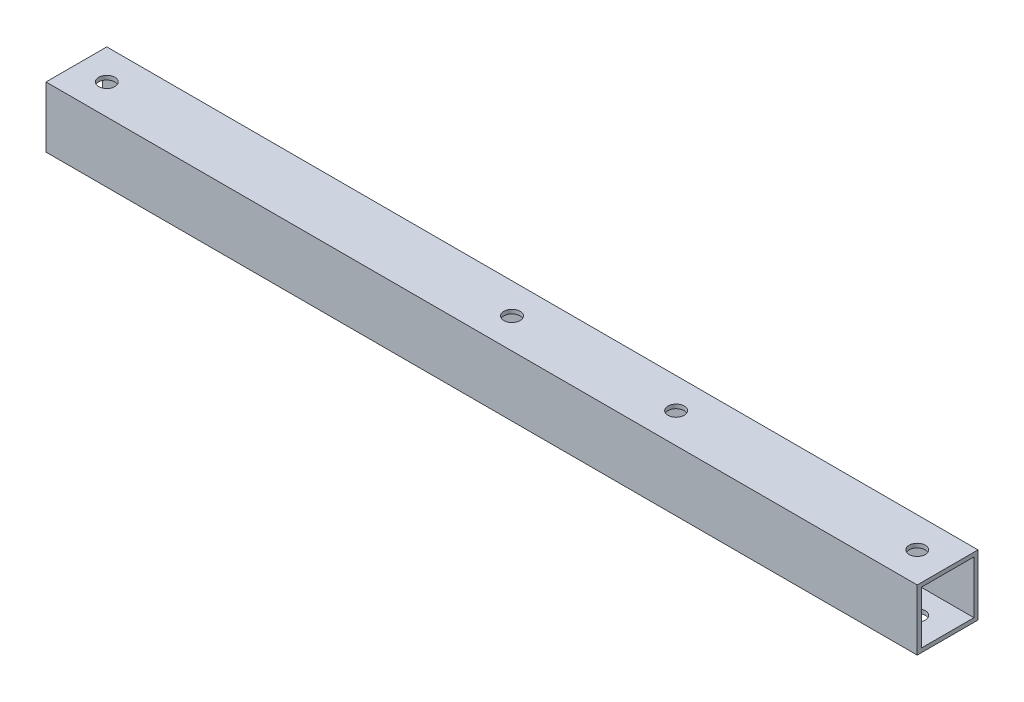
ISO-10303-21;
HEADER;
FILE_DESCRIPTION(('STEP AP214'),'2;1');
FILE_NAME('part.step','',(''),(''),'','','');
FILE_SCHEMA(('AUTOMOTIVE_DESIGN { 1 0 10303 214 1 1 1 1 }'));
ENDSEC;
DATA;
#1=APPLICATION_CONTEXT('core data for automotive mechanical design processes');
#2=APPLICATION_PROTOCOL_DEFINITION('international standard','automotive_design',2000,#1);
#3=PRODUCT_CONTEXT('',#1,'mechanical');
#4=PRODUCT('Part','Part','',(#3));
#5=PRODUCT_RELATED_PRODUCT_CATEGORY('part','',(#4));
#6=PRODUCT_DEFINITION_FORMATION('','',#4);
#7=PRODUCT_DEFINITION_CONTEXT('part definition',#1,'design');
#8=PRODUCT_DEFINITION('design','',#6,#7);
#9=PRODUCT_DEFINITION_SHAPE('','',#8);
#10=(LENGTH_UNIT() NAMED_UNIT(*) SI_UNIT(.MILLI.,.METRE.));
#11=(NAMED_UNIT(*) PLANE_ANGLE_UNIT() SI_UNIT($,.RADIAN.));
#12=(NAMED_UNIT(*) SI_UNIT($,.STERADIAN.) SOLID_ANGLE_UNIT());
#13=UNCERTAINTY_MEASURE_WITH_UNIT(LENGTH_MEASURE(1.E-05),#10,'distance_accuracy_value','');
#14=(GEOMETRIC_REPRESENTATION_CONTEXT(3) GLOBAL_UNCERTAINTY_ASSIGNED_CONTEXT((#13)) GLOBAL_UNIT_ASSIGNED_CONTEXT((#10,
#11,#12)) REPRESENTATION_CONTEXT('',''));
#15=CARTESIAN_POINT('',(0.,0.,0.));
#16=DIRECTION('',(0.,0.,1.));
#17=DIRECTION('',(1.,0.,0.));
#18=AXIS2_PLACEMENT_3D('',#15,#16,#17);
#19=CARTESIAN_POINT('',(215.,0.,0.));
#20=DIRECTION('',(1.,0.,0.));
#21=DIRECTION('',(0.,0.,-1.));
#22=AXIS2_PLACEMENT_3D('',#19,#20,#21);
#23=PLANE('',#22);
#24=DIRECTION('',(0.,-1.,0.));
#25=VECTOR('',#24,1.);
#26=CARTESIAN_POINT('',(215.,0.,0.));
#27=LINE('',#26,#25);
#28=CARTESIAN_POINT('',(215.,15.,0.));
#29=VERTEX_POINT('',#28);
#30=CARTESIAN_POINT('',(215.,0.,0.));
#31=VERTEX_POINT('',#30);
#32=EDGE_CURVE('E163',#29,#31,#27,.T.);
#33=ORIENTED_EDGE('',*,*,#32,.T.);
#34=DIRECTION('',(0.,0.,-1.));
#35=VECTOR('',#34,1.);
#36=CARTESIAN_POINT('',(215.,0.,0.));
#37=LINE('',#36,#35);
#38=CARTESIAN_POINT('',(215.,0.,-15.));
#39=VERTEX_POINT('',#38);
#40=EDGE_CURVE('E166',#31,#39,#37,.T.);
#41=ORIENTED_EDGE('',*,*,#40,.T.);
#42=DIRECTION('',(0.,1.,0.));
#43=VECTOR('',#42,1.);
#44=CARTESIAN_POINT('',(215.,0.,-15.));
#45=LINE('',#44,#43);
#46=CARTESIAN_POINT('',(215.,15.,-15.));
#47=VERTEX_POINT('',#46);
#48=EDGE_CURVE('E169',#39,#47,#45,.T.);
#49=ORIENTED_EDGE('',*,*,#48,.T.);
#50=DIRECTION('',(0.,0.,1.));
#51=VECTOR('',#50,1.);
#52=CARTESIAN_POINT('',(215.,15.,0.));
#53=LINE('',#52,#51);
#54=EDGE_CURVE('E171',#47,#29,#53,.T.);
#55=ORIENTED_EDGE('',*,*,#54,.T.);
#56=EDGE_LOOP('',(#33,#41,#49,#55));
#57=FACE_BOUND('',#56,.T.);
#58=DIRECTION('',(0.,0.,-1.));
#59=VECTOR('',#58,1.);
#60=CARTESIAN_POINT('',(215.,1.,0.));
#61=LINE('',#60,#59);
#62=CARTESIAN_POINT('',(215.,1.,-1.));
#63=VERTEX_POINT('',#62);
#64=CARTESIAN_POINT('',(215.,1.,-14.));
#65=VERTEX_POINT('',#64);
#66=EDGE_CURVE('E133',#63,#65,#61,.T.);
#67=ORIENTED_EDGE('',*,*,#66,.F.);
#68=DIRECTION('',(0.,-1.,0.));
#69=VECTOR('',#68,1.);
#70=CARTESIAN_POINT('',(215.,0.,-1.));
#71=LINE('',#70,#69);
#72=CARTESIAN_POINT('',(215.,14.,-1.));
#73=VERTEX_POINT('',#72);
#74=EDGE_CURVE('E125',#73,#63,#71,.T.);
#75=ORIENTED_EDGE('',*,*,#74,.F.);
#76=DIRECTION('',(0.,0.,1.));
#77=VECTOR('',#76,1.);
#78=CARTESIAN_POINT('',(215.,14.,0.));
#79=LINE('',#78,#77);
#80=CARTESIAN_POINT('',(215.,14.,-14.));
#81=VERTEX_POINT('',#80);
#82=EDGE_CURVE('E147',#81,#73,#79,.T.);
#83=ORIENTED_EDGE('',*,*,#82,.F.);
#84=DIRECTION('',(0.,1.,0.));
#85=VECTOR('',#84,1.);
#86=CARTESIAN_POINT('',(215.,0.,-14.));
#87=LINE('',#86,#85);
#88=EDGE_CURVE('E145',#65,#81,#87,.T.);
#89=ORIENTED_EDGE('',*,*,#88,.F.);
#90=EDGE_LOOP('',(#67,#75,#83,#89));
#91=FACE_BOUND('',#90,.T.);
#92=ADVANCED_FACE('F58',(#57,#91),#23,.T.);
#93=CARTESIAN_POINT('',(0.,0.,0.));
#94=DIRECTION('',(1.,0.,0.));
#95=DIRECTION('',(0.,0.,-1.));
#96=AXIS2_PLACEMENT_3D('',#93,#94,#95);
#97=PLANE('',#96);
#98=DIRECTION('',(0.,-1.,0.));
#99=VECTOR('',#98,1.);
#100=CARTESIAN_POINT('',(0.,0.,0.));
#101=LINE('',#100,#99);
#102=CARTESIAN_POINT('',(0.,15.,0.));
#103=VERTEX_POINT('',#102);
#104=CARTESIAN_POINT('',(0.,0.,0.));
#105=VERTEX_POINT('',#104);
#106=EDGE_CURVE('E141',#103,#105,#101,.T.);
#107=ORIENTED_EDGE('',*,*,#106,.F.);
#108=DIRECTION('',(0.,0.,1.));
#109=VECTOR('',#108,1.);
#110=CARTESIAN_POINT('',(0.,15.,0.));
#111=LINE('',#110,#109);
#112=CARTESIAN_POINT('',(0.,15.,-15.));
#113=VERTEX_POINT('',#112);
#114=EDGE_CURVE('E167',#113,#103,#111,.T.);
#115=ORIENTED_EDGE('',*,*,#114,.F.);
#116=DIRECTION('',(0.,1.,0.));
#117=VECTOR('',#116,1.);
#118=CARTESIAN_POINT('',(0.,0.,-15.));
#119=LINE('',#118,#117);
#120=CARTESIAN_POINT('',(0.,0.,-15.));
#121=VERTEX_POINT('',#120);
#122=EDGE_CURVE('E178',#121,#113,#119,.T.);
#123=ORIENTED_EDGE('',*,*,#122,.F.);
#124=DIRECTION('',(0.,0.,-1.));
#125=VECTOR('',#124,1.);
#126=CARTESIAN_POINT('',(0.,0.,0.));
#127=LINE('',#126,#125);
#128=EDGE_CURVE('E176',#105,#121,#127,.T.);
#129=ORIENTED_EDGE('',*,*,#128,.F.);
#130=EDGE_LOOP('',(#107,#115,#123,#129));
#131=FACE_BOUND('',#130,.T.);
#132=DIRECTION('',(0.,-1.,0.));
#133=VECTOR('',#132,1.);
#134=CARTESIAN_POINT('',(0.,0.,-1.));
#135=LINE('',#134,#133);
#136=CARTESIAN_POINT('',(0.,14.,-1.));
#137=VERTEX_POINT('',#136);
#138=CARTESIAN_POINT('',(0.,1.,-1.));
#139=VERTEX_POINT('',#138);
#140=EDGE_CURVE('E83',#137,#139,#135,.T.);
#141=ORIENTED_EDGE('',*,*,#140,.T.);
#142=DIRECTION('',(0.,0.,-1.));
#143=VECTOR('',#142,1.);
#144=CARTESIAN_POINT('',(0.,1.,0.));
#145=LINE('',#144,#143);
#146=CARTESIAN_POINT('',(0.,1.,-14.));
#147=VERTEX_POINT('',#146);
#148=EDGE_CURVE('E140',#139,#147,#145,.T.);
#149=ORIENTED_EDGE('',*,*,#148,.T.);
#150=DIRECTION('',(0.,1.,0.));
#151=VECTOR('',#150,1.);
#152=CARTESIAN_POINT('',(0.,0.,-14.));
#153=LINE('',#152,#151);
#154=CARTESIAN_POINT('',(0.,14.,-14.));
#155=VERTEX_POINT('',#154);
#156=EDGE_CURVE('E155',#147,#155,#153,.T.);
#157=ORIENTED_EDGE('',*,*,#156,.T.);
#158=DIRECTION('',(0.,0.,1.));
#159=VECTOR('',#158,1.);
#160=CARTESIAN_POINT('',(0.,14.,0.));
#161=LINE('',#160,#159);
#162=EDGE_CURVE('E134',#155,#137,#161,.T.);
#163=ORIENTED_EDGE('',*,*,#162,.T.);
#164=EDGE_LOOP('',(#141,#149,#157,#163));
#165=FACE_BOUND('',#164,.T.);
#166=ADVANCED_FACE('F230',(#131,#165),#97,.F.);
#167=CARTESIAN_POINT('',(215.,0.,0.));
#168=DIRECTION('',(0.,0.,-1.));
#169=DIRECTION('',(-1.,0.,0.));
#170=AXIS2_PLACEMENT_3D('',#167,#168,#169);
#171=PLANE('',#170);
#172=ORIENTED_EDGE('',*,*,#106,.T.);
#173=DIRECTION('',(-1.,0.,0.));
#174=VECTOR('',#173,1.);
#175=CARTESIAN_POINT('',(215.,0.,0.));
#176=LINE('',#175,#174);
#177=EDGE_CURVE('E12',#31,#105,#176,.T.);
#178=ORIENTED_EDGE('',*,*,#177,.F.);
#179=ORIENTED_EDGE('',*,*,#32,.F.);
#180=DIRECTION('',(-1.,0.,0.));
#181=VECTOR('',#180,1.);
#182=CARTESIAN_POINT('',(215.,15.,0.));
#183=LINE('',#182,#181);
#184=EDGE_CURVE('E173',#29,#103,#183,.T.);
#185=ORIENTED_EDGE('',*,*,#184,.T.);
#186=EDGE_LOOP('',(#172,#178,#179,#185));
#187=FACE_BOUND('',#186,.T.);
#188=ADVANCED_FACE('F60',(#187),#171,.F.);
#189=CARTESIAN_POINT('',(215.,0.,0.));
#190=DIRECTION('',(0.,1.,0.));
#191=DIRECTION('',(0.,0.,1.));
#192=AXIS2_PLACEMENT_3D('',#189,#190,#191);
#193=PLANE('',#192);
#194=CARTESIAN_POINT('',(7.5,0.,-7.5));
#195=DIRECTION('',(0.,1.,0.));
#196=DIRECTION('',(0.,0.,1.));
#197=AXIS2_PLACEMENT_3D('',#194,#195,#196);
#198=CIRCLE('',#197,2.);
#199=CARTESIAN_POINT('',(7.5,0.,-5.5));
#200=VERTEX_POINT('',#199);
#201=EDGE_CURVE('E266',#200,#200,#198,.F.);
#202=ORIENTED_EDGE('',*,*,#201,.F.);
#203=EDGE_LOOP('',(#202));
#204=FACE_BOUND('',#203,.T.);
#205=CARTESIAN_POINT('',(207.5,0.,-7.50000000000002));
#206=DIRECTION('',(0.,1.,0.));
#207=DIRECTION('',(0.,0.,1.));
#208=AXIS2_PLACEMENT_3D('',#205,#206,#207);
#209=CIRCLE('',#208,2.);
#210=CARTESIAN_POINT('',(207.5,0.,-5.50000000000003));
#211=VERTEX_POINT('',#210);
#212=EDGE_CURVE('E270',#211,#211,#209,.F.);
#213=ORIENTED_EDGE('',*,*,#212,.F.);
#214=EDGE_LOOP('',(#213));
#215=FACE_BOUND('',#214,.T.);
#216=CARTESIAN_POINT('',(148.,0.,-7.5));
#217=DIRECTION('',(0.,1.,0.));
#218=DIRECTION('',(0.,0.,1.));
#219=AXIS2_PLACEMENT_3D('',#216,#217,#218);
#220=CIRCLE('',#219,2.);
#221=CARTESIAN_POINT('',(148.,0.,-5.5));
#222=VERTEX_POINT('',#221);
#223=EDGE_CURVE('E274',#222,#222,#220,.F.);
#224=ORIENTED_EDGE('',*,*,#223,.F.);
#225=EDGE_LOOP('',(#224));
#226=FACE_BOUND('',#225,.T.);
#227=CARTESIAN_POINT('',(107.5,0.,-7.5));
#228=DIRECTION('',(0.,1.,0.));
#229=DIRECTION('',(0.,0.,1.));
#230=AXIS2_PLACEMENT_3D('',#227,#228,#229);
#231=CIRCLE('',#230,2.);
#232=CARTESIAN_POINT('',(107.5,0.,-5.5));
#233=VERTEX_POINT('',#232);
#234=EDGE_CURVE('E192',#233,#233,#231,.F.);
#235=ORIENTED_EDGE('',*,*,#234,.F.);
#236=EDGE_LOOP('',(#235));
#237=FACE_BOUND('',#236,.T.);
#238=ORIENTED_EDGE('',*,*,#128,.T.);
#239=DIRECTION('',(-1.,0.,0.));
#240=VECTOR('',#239,1.);
#241=CARTESIAN_POINT('',(215.,0.,-15.));
#242=LINE('',#241,#240);
#243=EDGE_CURVE('E67',#39,#121,#242,.T.);
#244=ORIENTED_EDGE('',*,*,#243,.F.);
#245=ORIENTED_EDGE('',*,*,#40,.F.);
#246=ORIENTED_EDGE('',*,*,#177,.T.);
#247=EDGE_LOOP('',(#238,#244,#245,#246));
#248=FACE_BOUND('',#247,.T.);
#249=ADVANCED_FACE('F255',(#204,#215,#226,#237,#248),#193,.F.);
#250=CARTESIAN_POINT('',(215.,0.,-15.));
#251=DIRECTION('',(0.,0.,1.));
#252=DIRECTION('',(1.,0.,0.));
#253=AXIS2_PLACEMENT_3D('',#250,#251,#252);
#254=PLANE('',#253);
#255=ORIENTED_EDGE('',*,*,#122,.T.);
#256=DIRECTION('',(-1.,0.,0.));
#257=VECTOR('',#256,1.);
#258=CARTESIAN_POINT('',(215.,15.,-15.));
#259=LINE('',#258,#257);
#260=EDGE_CURVE('E183',#47,#113,#259,.T.);
#261=ORIENTED_EDGE('',*,*,#260,.F.);
#262=ORIENTED_EDGE('',*,*,#48,.F.);
#263=ORIENTED_EDGE('',*,*,#243,.T.);
#264=EDGE_LOOP('',(#255,#261,#262,#263));
#265=FACE_BOUND('',#264,.T.);
#266=ADVANCED_FACE('F252',(#265),#254,.F.);
#267=CARTESIAN_POINT('',(215.,15.,0.));
#268=DIRECTION('',(0.,-1.,0.));
#269=DIRECTION('',(0.,0.,-1.));
#270=AXIS2_PLACEMENT_3D('',#267,#268,#269);
#271=PLANE('',#270);
#272=CARTESIAN_POINT('',(7.5,15.,-7.5));
#273=DIRECTION('',(0.,1.,0.));
#274=DIRECTION('',(0.,0.,1.));
#275=AXIS2_PLACEMENT_3D('',#272,#273,#274);
#276=CIRCLE('',#275,2.);
#277=CARTESIAN_POINT('',(7.5,15.,-5.5));
#278=VERTEX_POINT('',#277);
#279=EDGE_CURVE('E295',#278,#278,#276,.T.);
#280=ORIENTED_EDGE('',*,*,#279,.F.);
#281=EDGE_LOOP('',(#280));
#282=FACE_BOUND('',#281,.T.);
#283=CARTESIAN_POINT('',(207.5,15.,-7.50000000000002));
#284=DIRECTION('',(0.,1.,0.));
#285=DIRECTION('',(0.,0.,-1.));
#286=AXIS2_PLACEMENT_3D('',#283,#284,#285);
#287=CIRCLE('',#286,2.);
#288=CARTESIAN_POINT('',(207.5,15.,-9.50000000000002));
#289=VERTEX_POINT('',#288);
#290=EDGE_CURVE('E296',#289,#289,#287,.T.);
#291=ORIENTED_EDGE('',*,*,#290,.F.);
#292=EDGE_LOOP('',(#291));
#293=FACE_BOUND('',#292,.T.);
#294=CARTESIAN_POINT('',(148.,15.,-7.5));
#295=DIRECTION('',(0.,1.,0.));
#296=DIRECTION('',(0.,0.,1.));
#297=AXIS2_PLACEMENT_3D('',#294,#295,#296);
#298=CIRCLE('',#297,2.);
#299=CARTESIAN_POINT('',(148.,15.,-5.5));
#300=VERTEX_POINT('',#299);
#301=EDGE_CURVE('E303',#300,#300,#298,.T.);
#302=ORIENTED_EDGE('',*,*,#301,.F.);
#303=EDGE_LOOP('',(#302));
#304=FACE_BOUND('',#303,.T.);
#305=CARTESIAN_POINT('',(107.5,15.,-7.5));
#306=DIRECTION('',(0.,1.,0.));
#307=DIRECTION('',(0.,0.,1.));
#308=AXIS2_PLACEMENT_3D('',#305,#306,#307);
#309=CIRCLE('',#308,2.);
#310=CARTESIAN_POINT('',(107.5,15.,-5.5));
#311=VERTEX_POINT('',#310);
#312=EDGE_CURVE('E290',#311,#311,#309,.T.);
#313=ORIENTED_EDGE('',*,*,#312,.F.);
#314=EDGE_LOOP('',(#313));
#315=FACE_BOUND('',#314,.T.);
#316=ORIENTED_EDGE('',*,*,#114,.T.);
#317=ORIENTED_EDGE('',*,*,#184,.F.);
#318=ORIENTED_EDGE('',*,*,#54,.F.);
#319=ORIENTED_EDGE('',*,*,#260,.T.);
#320=EDGE_LOOP('',(#316,#317,#318,#319));
#321=FACE_BOUND('',#320,.T.);
#322=ADVANCED_FACE('F249',(#282,#293,#304,#315,#321),#271,.F.);
#323=CARTESIAN_POINT('',(215.,0.,-1.));
#324=DIRECTION('',(0.,0.,-1.));
#325=DIRECTION('',(-1.,0.,0.));
#326=AXIS2_PLACEMENT_3D('',#323,#324,#325);
#327=PLANE('',#326);
#328=ORIENTED_EDGE('',*,*,#140,.F.);
#329=DIRECTION('',(-1.,0.,0.));
#330=VECTOR('',#329,1.);
#331=CARTESIAN_POINT('',(215.,14.,-1.));
#332=LINE('',#331,#330);
#333=EDGE_CURVE('E129',#73,#137,#332,.T.);
#334=ORIENTED_EDGE('',*,*,#333,.F.);
#335=ORIENTED_EDGE('',*,*,#74,.T.);
#336=DIRECTION('',(-1.,0.,0.));
#337=VECTOR('',#336,1.);
#338=CARTESIAN_POINT('',(215.,1.,-1.));
#339=LINE('',#338,#337);
#340=EDGE_CURVE('E128',#63,#139,#339,.T.);
#341=ORIENTED_EDGE('',*,*,#340,.T.);
#342=EDGE_LOOP('',(#328,#334,#335,#341));
#343=FACE_BOUND('',#342,.T.);
#344=ADVANCED_FACE('F127',(#343),#327,.T.);
#345=CARTESIAN_POINT('',(215.,1.,0.));
#346=DIRECTION('',(0.,1.,0.));
#347=DIRECTION('',(0.,0.,1.));
#348=AXIS2_PLACEMENT_3D('',#345,#346,#347);
#349=PLANE('',#348);
#350=CARTESIAN_POINT('',(7.5,1.,-7.5));
#351=DIRECTION('',(0.,1.,0.));
#352=DIRECTION('',(0.,0.,1.));
#353=AXIS2_PLACEMENT_3D('',#350,#351,#352);
#354=CIRCLE('',#353,2.);
#355=CARTESIAN_POINT('',(7.5,1.,-5.5));
#356=VERTEX_POINT('',#355);
#357=EDGE_CURVE('E153',#356,#356,#354,.T.);
#358=ORIENTED_EDGE('',*,*,#357,.F.);
#359=EDGE_LOOP('',(#358));
#360=FACE_BOUND('',#359,.T.);
#361=CARTESIAN_POINT('',(207.5,1.,-7.50000000000002));
#362=DIRECTION('',(0.,1.,0.));
#363=DIRECTION('',(0.,0.,1.));
#364=AXIS2_PLACEMENT_3D('',#361,#362,#363);
#365=CIRCLE('',#364,2.);
#366=CARTESIAN_POINT('',(207.5,1.,-5.50000000000003));
#367=VERTEX_POINT('',#366);
#368=EDGE_CURVE('E198',#367,#367,#365,.T.);
#369=ORIENTED_EDGE('',*,*,#368,.F.);
#370=EDGE_LOOP('',(#369));
#371=FACE_BOUND('',#370,.T.);
#372=CARTESIAN_POINT('',(148.,1.,-7.5));
#373=DIRECTION('',(0.,1.,0.));
#374=DIRECTION('',(0.,0.,1.));
#375=AXIS2_PLACEMENT_3D('',#372,#373,#374);
#376=CIRCLE('',#375,2.);
#377=CARTESIAN_POINT('',(148.,1.,-5.5));
#378=VERTEX_POINT('',#377);
#379=EDGE_CURVE('E195',#378,#378,#376,.T.);
#380=ORIENTED_EDGE('',*,*,#379,.F.);
#381=EDGE_LOOP('',(#380));
#382=FACE_BOUND('',#381,.T.);
#383=CARTESIAN_POINT('',(107.5,1.,-7.5));
#384=DIRECTION('',(0.,1.,0.));
#385=DIRECTION('',(0.,0.,1.));
#386=AXIS2_PLACEMENT_3D('',#383,#384,#385);
#387=CIRCLE('',#386,2.);
#388=CARTESIAN_POINT('',(107.5,1.,-5.5));
#389=VERTEX_POINT('',#388);
#390=EDGE_CURVE('E191',#389,#389,#387,.T.);
#391=ORIENTED_EDGE('',*,*,#390,.F.);
#392=EDGE_LOOP('',(#391));
#393=FACE_BOUND('',#392,.T.);
#394=ORIENTED_EDGE('',*,*,#148,.F.);
#395=ORIENTED_EDGE('',*,*,#340,.F.);
#396=ORIENTED_EDGE('',*,*,#66,.T.);
#397=DIRECTION('',(-1.,0.,0.));
#398=VECTOR('',#397,1.);
#399=CARTESIAN_POINT('',(215.,1.,-14.));
#400=LINE('',#399,#398);
#401=EDGE_CURVE('E142',#65,#147,#400,.T.);
#402=ORIENTED_EDGE('',*,*,#401,.T.);
#403=EDGE_LOOP('',(#394,#395,#396,#402));
#404=FACE_BOUND('',#403,.T.);
#405=ADVANCED_FACE('F137',(#360,#371,#382,#393,#404),#349,.T.);
#406=CARTESIAN_POINT('',(215.,0.,-14.));
#407=DIRECTION('',(0.,0.,1.));
#408=DIRECTION('',(1.,0.,0.));
#409=AXIS2_PLACEMENT_3D('',#406,#407,#408);
#410=PLANE('',#409);
#411=ORIENTED_EDGE('',*,*,#156,.F.);
#412=ORIENTED_EDGE('',*,*,#401,.F.);
#413=ORIENTED_EDGE('',*,*,#88,.T.);
#414=DIRECTION('',(-1.,0.,0.));
#415=VECTOR('',#414,1.);
#416=CARTESIAN_POINT('',(215.,14.,-14.));
#417=LINE('',#416,#415);
#418=EDGE_CURVE('E75',#81,#155,#417,.T.);
#419=ORIENTED_EDGE('',*,*,#418,.T.);
#420=EDGE_LOOP('',(#411,#412,#413,#419));
#421=FACE_BOUND('',#420,.T.);
#422=ADVANCED_FACE('F222',(#421),#410,.T.);
#423=CARTESIAN_POINT('',(215.,14.,0.));
#424=DIRECTION('',(0.,-1.,0.));
#425=DIRECTION('',(0.,0.,-1.));
#426=AXIS2_PLACEMENT_3D('',#423,#424,#425);
#427=PLANE('',#426);
#428=CARTESIAN_POINT('',(7.5,14.,-7.5));
#429=DIRECTION('',(0.,-1.,0.));
#430=DIRECTION('',(0.,0.,-1.));
#431=AXIS2_PLACEMENT_3D('',#428,#429,#430);
#432=CIRCLE('',#431,2.);
#433=CARTESIAN_POINT('',(7.5,14.,-9.5));
#434=VERTEX_POINT('',#433);
#435=EDGE_CURVE('E62',#434,#434,#432,.T.);
#436=ORIENTED_EDGE('',*,*,#435,.F.);
#437=EDGE_LOOP('',(#436));
#438=FACE_BOUND('',#437,.T.);
#439=CARTESIAN_POINT('',(207.5,14.,-7.50000000000002));
#440=DIRECTION('',(0.,-1.,0.));
#441=DIRECTION('',(0.,0.,-1.));
#442=AXIS2_PLACEMENT_3D('',#439,#440,#441);
#443=CIRCLE('',#442,2.);
#444=CARTESIAN_POINT('',(207.5,14.,-9.50000000000002));
#445=VERTEX_POINT('',#444);
#446=EDGE_CURVE('E196',#445,#445,#443,.T.);
#447=ORIENTED_EDGE('',*,*,#446,.F.);
#448=EDGE_LOOP('',(#447));
#449=FACE_BOUND('',#448,.T.);
#450=CARTESIAN_POINT('',(148.,14.,-7.5));
#451=DIRECTION('',(0.,-1.,0.));
#452=DIRECTION('',(0.,0.,-1.));
#453=AXIS2_PLACEMENT_3D('',#450,#451,#452);
#454=CIRCLE('',#453,2.);
#455=CARTESIAN_POINT('',(148.,14.,-9.5));
#456=VERTEX_POINT('',#455);
#457=EDGE_CURVE('E193',#456,#456,#454,.T.);
#458=ORIENTED_EDGE('',*,*,#457,.F.);
#459=EDGE_LOOP('',(#458));
#460=FACE_BOUND('',#459,.T.);
#461=CARTESIAN_POINT('',(107.5,14.,-7.5));
#462=DIRECTION('',(0.,-1.,0.));
#463=DIRECTION('',(0.,0.,-1.));
#464=AXIS2_PLACEMENT_3D('',#461,#462,#463);
#465=CIRCLE('',#464,2.);
#466=CARTESIAN_POINT('',(107.5,14.,-9.5));
#467=VERTEX_POINT('',#466);
#468=EDGE_CURVE('E188',#467,#467,#465,.T.);
#469=ORIENTED_EDGE('',*,*,#468,.F.);
#470=EDGE_LOOP('',(#469));
#471=FACE_BOUND('',#470,.T.);
#472=ORIENTED_EDGE('',*,*,#162,.F.);
#473=ORIENTED_EDGE('',*,*,#418,.F.);
#474=ORIENTED_EDGE('',*,*,#82,.T.);
#475=ORIENTED_EDGE('',*,*,#333,.T.);
#476=EDGE_LOOP('',(#472,#473,#474,#475));
#477=FACE_BOUND('',#476,.T.);
#478=ADVANCED_FACE('F218',(#438,#449,#460,#471,#477),#427,.T.);
#479=CARTESIAN_POINT('',(107.5,-5.65685424949238,-7.5));
#480=DIRECTION('',(0.,1.,0.));
#481=DIRECTION('',(0.,0.,1.));
#482=AXIS2_PLACEMENT_3D('',#479,#480,#481);
#483=CYLINDRICAL_SURFACE('',#482,2.);
#484=ORIENTED_EDGE('',*,*,#468,.T.);
#485=EDGE_LOOP('',(#484));
#486=FACE_BOUND('',#485,.T.);
#487=ORIENTED_EDGE('',*,*,#312,.T.);
#488=EDGE_LOOP('',(#487));
#489=FACE_BOUND('',#488,.T.);
#490=ADVANCED_FACE('F221',(#486,#489),#483,.F.);
#491=CARTESIAN_POINT('',(148.,-5.65685424949238,-7.5));
#492=DIRECTION('',(0.,1.,0.));
#493=DIRECTION('',(0.,0.,1.));
#494=AXIS2_PLACEMENT_3D('',#491,#492,#493);
#495=CYLINDRICAL_SURFACE('',#494,2.);
#496=ORIENTED_EDGE('',*,*,#457,.T.);
#497=EDGE_LOOP('',(#496));
#498=FACE_BOUND('',#497,.T.);
#499=ORIENTED_EDGE('',*,*,#301,.T.);
#500=EDGE_LOOP('',(#499));
#501=FACE_BOUND('',#500,.T.);
#502=ADVANCED_FACE('F307',(#498,#501),#495,.F.);
#503=CARTESIAN_POINT('',(207.5,-5.65685424949238,-7.50000000000002));
#504=DIRECTION('',(0.,1.,0.));
#505=DIRECTION('',(0.,0.,1.));
#506=AXIS2_PLACEMENT_3D('',#503,#504,#505);
#507=CYLINDRICAL_SURFACE('',#506,2.);
#508=ORIENTED_EDGE('',*,*,#446,.T.);
#509=EDGE_LOOP('',(#508));
#510=FACE_BOUND('',#509,.T.);
#511=ORIENTED_EDGE('',*,*,#290,.T.);
#512=EDGE_LOOP('',(#511));
#513=FACE_BOUND('',#512,.T.);
#514=ADVANCED_FACE('F319',(#510,#513),#507,.F.);
#515=CARTESIAN_POINT('',(7.5,-5.65685424949238,-7.5));
#516=DIRECTION('',(0.,1.,0.));
#517=DIRECTION('',(0.,0.,1.));
#518=AXIS2_PLACEMENT_3D('',#515,#516,#517);
#519=CYLINDRICAL_SURFACE('',#518,2.);
#520=ORIENTED_EDGE('',*,*,#435,.T.);
#521=EDGE_LOOP('',(#520));
#522=FACE_BOUND('',#521,.T.);
#523=ORIENTED_EDGE('',*,*,#279,.T.);
#524=EDGE_LOOP('',(#523));
#525=FACE_BOUND('',#524,.T.);
#526=ADVANCED_FACE('F215',(#522,#525),#519,.F.);
#527=ORIENTED_EDGE('',*,*,#390,.T.);
#528=EDGE_LOOP('',(#527));
#529=FACE_BOUND('',#528,.T.);
#530=ORIENTED_EDGE('',*,*,#234,.T.);
#531=EDGE_LOOP('',(#530));
#532=FACE_BOUND('',#531,.T.);
#533=ADVANCED_FACE('F315',(#529,#532),#483,.F.);
#534=ORIENTED_EDGE('',*,*,#379,.T.);
#535=EDGE_LOOP('',(#534));
#536=FACE_BOUND('',#535,.T.);
#537=ORIENTED_EDGE('',*,*,#223,.T.);
#538=EDGE_LOOP('',(#537));
#539=FACE_BOUND('',#538,.T.);
#540=ADVANCED_FACE('F322',(#536,#539),#495,.F.);
#541=ORIENTED_EDGE('',*,*,#368,.T.);
#542=EDGE_LOOP('',(#541));
#543=FACE_BOUND('',#542,.T.);
#544=ORIENTED_EDGE('',*,*,#212,.T.);
#545=EDGE_LOOP('',(#544));
#546=FACE_BOUND('',#545,.T.);
#547=ADVANCED_FACE('F330',(#543,#546),#507,.F.);
#548=ORIENTED_EDGE('',*,*,#357,.T.);
#549=EDGE_LOOP('',(#548));
#550=FACE_BOUND('',#549,.T.);
#551=ORIENTED_EDGE('',*,*,#201,.T.);
#552=EDGE_LOOP('',(#551));
#553=FACE_BOUND('',#552,.T.);
#554=ADVANCED_FACE('F332',(#550,#553),#519,.F.);
#555=CLOSED_SHELL('',(#92,#166,#188,#249,#266,#322,#344,#405,#422,#478,#490,#502,#514,#526,#533,
#540,#547,#554));
#556=MANIFOLD_SOLID_BREP('B2',#555);
#557=ADVANCED_BREP_SHAPE_REPRESENTATION('',(#18,#556),#14);
#558=SHAPE_DEFINITION_REPRESENTATION(#9,#557);
ENDSEC;
END-ISO-10303-21;
